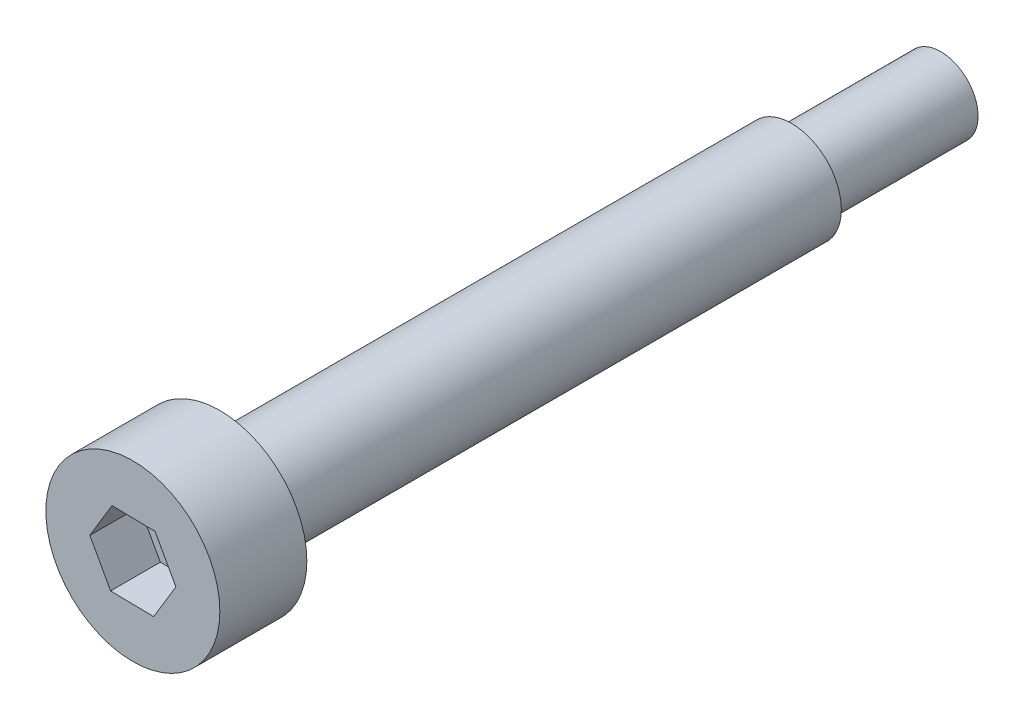
ISO-10303-21;
HEADER;
FILE_DESCRIPTION(('STEP AP214'),'2;1');
FILE_NAME('part.step','',(''),(''),'','','');
FILE_SCHEMA(('AUTOMOTIVE_DESIGN { 1 0 10303 214 1 1 1 1 }'));
ENDSEC;
DATA;
#1=APPLICATION_CONTEXT('core data for automotive mechanical design processes');
#2=APPLICATION_PROTOCOL_DEFINITION('international standard','automotive_design',2000,#1);
#3=PRODUCT_CONTEXT('',#1,'mechanical');
#4=PRODUCT('Part','Part','',(#3));
#5=PRODUCT_RELATED_PRODUCT_CATEGORY('part','',(#4));
#6=PRODUCT_DEFINITION_FORMATION('','',#4);
#7=PRODUCT_DEFINITION_CONTEXT('part definition',#1,'design');
#8=PRODUCT_DEFINITION('design','',#6,#7);
#9=PRODUCT_DEFINITION_SHAPE('','',#8);
#10=(LENGTH_UNIT() NAMED_UNIT(*) SI_UNIT(.MILLI.,.METRE.));
#11=(NAMED_UNIT(*) PLANE_ANGLE_UNIT() SI_UNIT($,.RADIAN.));
#12=(NAMED_UNIT(*) SI_UNIT($,.STERADIAN.) SOLID_ANGLE_UNIT());
#13=UNCERTAINTY_MEASURE_WITH_UNIT(LENGTH_MEASURE(1.E-05),#10,'distance_accuracy_value','');
#14=(GEOMETRIC_REPRESENTATION_CONTEXT(3) GLOBAL_UNCERTAINTY_ASSIGNED_CONTEXT((#13)) GLOBAL_UNIT_ASSIGNED_CONTEXT((#10,
#11,#12)) REPRESENTATION_CONTEXT('',''));
#15=CARTESIAN_POINT('',(0.,0.,0.));
#16=DIRECTION('',(0.,0.,1.));
#17=DIRECTION('',(1.,0.,0.));
#18=AXIS2_PLACEMENT_3D('',#15,#16,#17);
#19=CARTESIAN_POINT('',(0.,0.,3.5));
#20=DIRECTION('',(0.,0.,-1.));
#21=DIRECTION('',(-1.,0.,0.));
#22=AXIS2_PLACEMENT_3D('',#19,#20,#21);
#23=CYLINDRICAL_SURFACE('',#22,3.5);
#24=CARTESIAN_POINT('',(0.,0.,3.5));
#25=DIRECTION('',(0.,0.,1.));
#26=DIRECTION('',(1.,0.,0.));
#27=AXIS2_PLACEMENT_3D('',#24,#25,#26);
#28=CIRCLE('',#27,3.5);
#29=CARTESIAN_POINT('',(3.5,0.,3.5));
#30=VERTEX_POINT('',#29);
#31=EDGE_CURVE('E43',#30,#30,#28,.T.);
#32=ORIENTED_EDGE('',*,*,#31,.F.);
#33=EDGE_LOOP('',(#32));
#34=FACE_BOUND('',#33,.T.);
#35=CARTESIAN_POINT('',(0.,0.,0.));
#36=DIRECTION('',(0.,0.,1.));
#37=DIRECTION('',(1.,0.,0.));
#38=AXIS2_PLACEMENT_3D('',#35,#36,#37);
#39=CIRCLE('',#38,3.5);
#40=CARTESIAN_POINT('',(3.5,0.,0.));
#41=VERTEX_POINT('',#40);
#42=EDGE_CURVE('E138',#41,#41,#39,.T.);
#43=ORIENTED_EDGE('',*,*,#42,.T.);
#44=EDGE_LOOP('',(#43));
#45=FACE_BOUND('',#44,.T.);
#46=ADVANCED_FACE('F36',(#34,#45),#23,.T.);
#47=CARTESIAN_POINT('',(0.,0.,3.5));
#48=DIRECTION('',(0.,0.,1.));
#49=DIRECTION('',(1.,0.,0.));
#50=AXIS2_PLACEMENT_3D('',#47,#48,#49);
#51=PLANE('',#50);
#52=DIRECTION('',(-0.483885708586405,0.875131202178183,0.));
#53=VECTOR('',#52,1.);
#54=CARTESIAN_POINT('',(1.73175411943134,-0.0320572898511147,3.5));
#55=LINE('',#54,#53);
#56=CARTESIAN_POINT('',(1.73175411943134,-0.0320572898511147,3.5));
#57=VERTEX_POINT('',#56);
#58=CARTESIAN_POINT('',(0.893639487103215,1.48371441561033,3.5));
#59=VERTEX_POINT('',#58);
#60=EDGE_CURVE('E50',#57,#59,#55,.T.);
#61=ORIENTED_EDGE('',*,*,#60,.F.);
#62=DIRECTION('',(0.51594299843752,0.856622917253152,0.));
#63=VECTOR('',#62,1.);
#64=CARTESIAN_POINT('',(0.838114632328121,-1.51577170546145,3.5));
#65=LINE('',#64,#63);
#66=CARTESIAN_POINT('',(0.838114632328121,-1.51577170546145,3.5));
#67=VERTEX_POINT('',#66);
#68=EDGE_CURVE('E134',#67,#57,#65,.T.);
#69=ORIENTED_EDGE('',*,*,#68,.F.);
#70=DIRECTION('',(0.999828707023925,-0.0185082849250311,0.));
#71=VECTOR('',#70,1.);
#72=CARTESIAN_POINT('',(-0.893639487103214,-1.48371441561033,3.5));
#73=LINE('',#72,#71);
#74=CARTESIAN_POINT('',(-0.893639487103214,-1.48371441561033,3.5));
#75=VERTEX_POINT('',#74);
#76=EDGE_CURVE('E132',#75,#67,#73,.T.);
#77=ORIENTED_EDGE('',*,*,#76,.F.);
#78=DIRECTION('',(0.483885708586405,-0.875131202178183,0.));
#79=VECTOR('',#78,1.);
#80=CARTESIAN_POINT('',(-1.73175411943134,0.0320572898511147,3.5));
#81=LINE('',#80,#79);
#82=CARTESIAN_POINT('',(-1.73175411943134,0.0320572898511147,3.5));
#83=VERTEX_POINT('',#82);
#84=EDGE_CURVE('E98',#83,#75,#81,.T.);
#85=ORIENTED_EDGE('',*,*,#84,.F.);
#86=DIRECTION('',(-0.51594299843752,-0.856622917253152,0.));
#87=VECTOR('',#86,1.);
#88=CARTESIAN_POINT('',(-0.838114632328121,1.51577170546145,3.5));
#89=LINE('',#88,#87);
#90=CARTESIAN_POINT('',(-0.838114632328121,1.51577170546145,3.5));
#91=VERTEX_POINT('',#90);
#92=EDGE_CURVE('E128',#91,#83,#89,.T.);
#93=ORIENTED_EDGE('',*,*,#92,.F.);
#94=DIRECTION('',(-0.999828707023925,0.0185082849250311,0.));
#95=VECTOR('',#94,1.);
#96=CARTESIAN_POINT('',(0.893639487103215,1.48371441561033,3.5));
#97=LINE('',#96,#95);
#98=EDGE_CURVE('E124',#59,#91,#97,.T.);
#99=ORIENTED_EDGE('',*,*,#98,.F.);
#100=EDGE_LOOP('',(#61,#69,#77,#85,#93,#99));
#101=FACE_BOUND('',#100,.T.);
#102=ORIENTED_EDGE('',*,*,#31,.T.);
#103=EDGE_LOOP('',(#102));
#104=FACE_BOUND('',#103,.T.);
#105=ADVANCED_FACE('F152',(#101,#104),#51,.T.);
#106=CARTESIAN_POINT('',(0.,0.,0.));
#107=DIRECTION('',(0.,0.,1.));
#108=DIRECTION('',(1.,0.,0.));
#109=AXIS2_PLACEMENT_3D('',#106,#107,#108);
#110=PLANE('',#109);
#111=CARTESIAN_POINT('',(0.,0.,0.));
#112=DIRECTION('',(0.,0.,1.));
#113=DIRECTION('',(1.,0.,0.));
#114=AXIS2_PLACEMENT_3D('',#111,#112,#113);
#115=CIRCLE('',#114,2.);
#116=CARTESIAN_POINT('',(2.,0.,0.));
#117=VERTEX_POINT('',#116);
#118=EDGE_CURVE('E11',#117,#117,#115,.F.);
#119=ORIENTED_EDGE('',*,*,#118,.F.);
#120=EDGE_LOOP('',(#119));
#121=FACE_BOUND('',#120,.T.);
#122=ORIENTED_EDGE('',*,*,#42,.F.);
#123=EDGE_LOOP('',(#122));
#124=FACE_BOUND('',#123,.T.);
#125=ADVANCED_FACE('F149',(#121,#124),#110,.F.);
#126=CARTESIAN_POINT('',(1.73175411943134,-0.0320572898511147,1.5));
#127=DIRECTION('',(0.875131202178183,0.483885708586405,0.));
#128=DIRECTION('',(-0.483885708586405,0.875131202178183,0.));
#129=AXIS2_PLACEMENT_3D('',#126,#127,#128);
#130=PLANE('',#129);
#131=ORIENTED_EDGE('',*,*,#60,.T.);
#132=DIRECTION('',(0.,0.,1.));
#133=VECTOR('',#132,1.);
#134=CARTESIAN_POINT('',(0.893639487103215,1.48371441561033,1.5));
#135=LINE('',#134,#133);
#136=CARTESIAN_POINT('',(0.893639487103215,1.48371441561033,1.5));
#137=VERTEX_POINT('',#136);
#138=EDGE_CURVE('E80',#137,#59,#135,.T.);
#139=ORIENTED_EDGE('',*,*,#138,.F.);
#140=DIRECTION('',(-0.483885708586405,0.875131202178183,0.));
#141=VECTOR('',#140,1.);
#142=CARTESIAN_POINT('',(1.73175411943134,-0.0320572898511147,1.5));
#143=LINE('',#142,#141);
#144=CARTESIAN_POINT('',(1.73175411943134,-0.0320572898511147,1.5));
#145=VERTEX_POINT('',#144);
#146=EDGE_CURVE('E136',#145,#137,#143,.T.);
#147=ORIENTED_EDGE('',*,*,#146,.F.);
#148=DIRECTION('',(0.,0.,1.));
#149=VECTOR('',#148,1.);
#150=CARTESIAN_POINT('',(1.73175411943134,-0.0320572898511147,1.5));
#151=LINE('',#150,#149);
#152=EDGE_CURVE('E58',#145,#57,#151,.T.);
#153=ORIENTED_EDGE('',*,*,#152,.T.);
#154=EDGE_LOOP('',(#131,#139,#147,#153));
#155=FACE_BOUND('',#154,.T.);
#156=ADVANCED_FACE('F151',(#155),#130,.F.);
#157=CARTESIAN_POINT('',(0.838114632328121,-1.51577170546145,1.5));
#158=DIRECTION('',(0.856622917253152,-0.51594299843752,0.));
#159=DIRECTION('',(0.51594299843752,0.856622917253153,0.));
#160=AXIS2_PLACEMENT_3D('',#157,#158,#159);
#161=PLANE('',#160);
#162=ORIENTED_EDGE('',*,*,#68,.T.);
#163=ORIENTED_EDGE('',*,*,#152,.F.);
#164=DIRECTION('',(0.51594299843752,0.856622917253152,0.));
#165=VECTOR('',#164,1.);
#166=CARTESIAN_POINT('',(0.838114632328121,-1.51577170546145,1.5));
#167=LINE('',#166,#165);
#168=CARTESIAN_POINT('',(0.838114632328121,-1.51577170546145,1.5));
#169=VERTEX_POINT('',#168);
#170=EDGE_CURVE('E110',#169,#145,#167,.T.);
#171=ORIENTED_EDGE('',*,*,#170,.F.);
#172=DIRECTION('',(0.,0.,1.));
#173=VECTOR('',#172,1.);
#174=CARTESIAN_POINT('',(0.838114632328121,-1.51577170546145,1.5));
#175=LINE('',#174,#173);
#176=EDGE_CURVE('E102',#169,#67,#175,.T.);
#177=ORIENTED_EDGE('',*,*,#176,.T.);
#178=EDGE_LOOP('',(#162,#163,#171,#177));
#179=FACE_BOUND('',#178,.T.);
#180=ADVANCED_FACE('F158',(#179),#161,.F.);
#181=CARTESIAN_POINT('',(-0.893639487103214,-1.48371441561033,1.5));
#182=DIRECTION('',(-0.0185082849250311,-0.999828707023925,0.));
#183=DIRECTION('',(0.999828707023925,-0.0185082849250311,0.));
#184=AXIS2_PLACEMENT_3D('',#181,#182,#183);
#185=PLANE('',#184);
#186=ORIENTED_EDGE('',*,*,#76,.T.);
#187=ORIENTED_EDGE('',*,*,#176,.F.);
#188=DIRECTION('',(0.999828707023925,-0.0185082849250311,0.));
#189=VECTOR('',#188,1.);
#190=CARTESIAN_POINT('',(-0.893639487103214,-1.48371441561033,1.5));
#191=LINE('',#190,#189);
#192=CARTESIAN_POINT('',(-0.893639487103214,-1.48371441561033,1.5));
#193=VERTEX_POINT('',#192);
#194=EDGE_CURVE('E106',#193,#169,#191,.T.);
#195=ORIENTED_EDGE('',*,*,#194,.F.);
#196=DIRECTION('',(0.,0.,1.));
#197=VECTOR('',#196,1.);
#198=CARTESIAN_POINT('',(-0.893639487103214,-1.48371441561033,1.5));
#199=LINE('',#198,#197);
#200=EDGE_CURVE('E91',#193,#75,#199,.T.);
#201=ORIENTED_EDGE('',*,*,#200,.T.);
#202=EDGE_LOOP('',(#186,#187,#195,#201));
#203=FACE_BOUND('',#202,.T.);
#204=ADVANCED_FACE('F107',(#203),#185,.F.);
#205=CARTESIAN_POINT('',(-1.73175411943134,0.0320572898511147,1.5));
#206=DIRECTION('',(-0.875131202178183,-0.483885708586405,0.));
#207=DIRECTION('',(0.483885708586405,-0.875131202178183,0.));
#208=AXIS2_PLACEMENT_3D('',#205,#206,#207);
#209=PLANE('',#208);
#210=ORIENTED_EDGE('',*,*,#84,.T.);
#211=ORIENTED_EDGE('',*,*,#200,.F.);
#212=DIRECTION('',(0.483885708586405,-0.875131202178183,0.));
#213=VECTOR('',#212,1.);
#214=CARTESIAN_POINT('',(-1.73175411943134,0.0320572898511147,1.5));
#215=LINE('',#214,#213);
#216=CARTESIAN_POINT('',(-1.73175411943134,0.0320572898511147,1.5));
#217=VERTEX_POINT('',#216);
#218=EDGE_CURVE('E95',#217,#193,#215,.T.);
#219=ORIENTED_EDGE('',*,*,#218,.F.);
#220=DIRECTION('',(0.,0.,1.));
#221=VECTOR('',#220,1.);
#222=CARTESIAN_POINT('',(-1.73175411943134,0.0320572898511147,1.5));
#223=LINE('',#222,#221);
#224=EDGE_CURVE('E103',#217,#83,#223,.T.);
#225=ORIENTED_EDGE('',*,*,#224,.T.);
#226=EDGE_LOOP('',(#210,#211,#219,#225));
#227=FACE_BOUND('',#226,.T.);
#228=ADVANCED_FACE('F93',(#227),#209,.F.);
#229=CARTESIAN_POINT('',(-0.838114632328121,1.51577170546145,1.5));
#230=DIRECTION('',(-0.856622917253152,0.51594299843752,0.));
#231=DIRECTION('',(-0.51594299843752,-0.856622917253153,0.));
#232=AXIS2_PLACEMENT_3D('',#229,#230,#231);
#233=PLANE('',#232);
#234=ORIENTED_EDGE('',*,*,#92,.T.);
#235=ORIENTED_EDGE('',*,*,#224,.F.);
#236=DIRECTION('',(-0.51594299843752,-0.856622917253152,0.));
#237=VECTOR('',#236,1.);
#238=CARTESIAN_POINT('',(-0.838114632328121,1.51577170546145,1.5));
#239=LINE('',#238,#237);
#240=CARTESIAN_POINT('',(-0.838114632328121,1.51577170546145,1.5));
#241=VERTEX_POINT('',#240);
#242=EDGE_CURVE('E116',#241,#217,#239,.T.);
#243=ORIENTED_EDGE('',*,*,#242,.F.);
#244=DIRECTION('',(0.,0.,1.));
#245=VECTOR('',#244,1.);
#246=CARTESIAN_POINT('',(-0.838114632328121,1.51577170546145,1.5));
#247=LINE('',#246,#245);
#248=EDGE_CURVE('E141',#241,#91,#247,.T.);
#249=ORIENTED_EDGE('',*,*,#248,.T.);
#250=EDGE_LOOP('',(#234,#235,#243,#249));
#251=FACE_BOUND('',#250,.T.);
#252=ADVANCED_FACE('F205',(#251),#233,.F.);
#253=CARTESIAN_POINT('',(0.893639487103215,1.48371441561033,1.5));
#254=DIRECTION('',(0.0185082849250311,0.999828707023925,0.));
#255=DIRECTION('',(-0.999828707023925,0.0185082849250311,0.));
#256=AXIS2_PLACEMENT_3D('',#253,#254,#255);
#257=PLANE('',#256);
#258=ORIENTED_EDGE('',*,*,#98,.T.);
#259=ORIENTED_EDGE('',*,*,#248,.F.);
#260=DIRECTION('',(-0.999828707023925,0.0185082849250311,0.));
#261=VECTOR('',#260,1.);
#262=CARTESIAN_POINT('',(0.893639487103215,1.48371441561033,1.5));
#263=LINE('',#262,#261);
#264=EDGE_CURVE('E118',#137,#241,#263,.T.);
#265=ORIENTED_EDGE('',*,*,#264,.F.);
#266=ORIENTED_EDGE('',*,*,#138,.T.);
#267=EDGE_LOOP('',(#258,#259,#265,#266));
#268=FACE_BOUND('',#267,.T.);
#269=ADVANCED_FACE('F214',(#268),#257,.F.);
#270=CARTESIAN_POINT('',(0.,0.,1.5));
#271=DIRECTION('',(0.,0.,1.));
#272=DIRECTION('',(1.,0.,0.));
#273=AXIS2_PLACEMENT_3D('',#270,#271,#272);
#274=PLANE('',#273);
#275=ORIENTED_EDGE('',*,*,#146,.T.);
#276=ORIENTED_EDGE('',*,*,#264,.T.);
#277=ORIENTED_EDGE('',*,*,#242,.T.);
#278=ORIENTED_EDGE('',*,*,#218,.T.);
#279=ORIENTED_EDGE('',*,*,#194,.T.);
#280=ORIENTED_EDGE('',*,*,#170,.T.);
#281=EDGE_LOOP('',(#275,#276,#277,#278,#279,#280));
#282=FACE_BOUND('',#281,.T.);
#283=ADVANCED_FACE('F113',(#282),#274,.T.);
#284=CARTESIAN_POINT('',(0.,0.,-23.));
#285=DIRECTION('',(0.,0.,1.));
#286=DIRECTION('',(1.,0.,0.));
#287=AXIS2_PLACEMENT_3D('',#284,#285,#286);
#288=CYLINDRICAL_SURFACE('',#287,2.);
#289=CARTESIAN_POINT('',(0.,0.,-23.));
#290=DIRECTION('',(0.,0.,-1.));
#291=DIRECTION('',(-1.,0.,0.));
#292=AXIS2_PLACEMENT_3D('',#289,#290,#291);
#293=CIRCLE('',#292,2.);
#294=CARTESIAN_POINT('',(-2.,0.,-23.));
#295=VERTEX_POINT('',#294);
#296=EDGE_CURVE('E125',#295,#295,#293,.T.);
#297=ORIENTED_EDGE('',*,*,#296,.F.);
#298=EDGE_LOOP('',(#297));
#299=FACE_BOUND('',#298,.T.);
#300=ORIENTED_EDGE('',*,*,#118,.T.);
#301=EDGE_LOOP('',(#300));
#302=FACE_BOUND('',#301,.T.);
#303=ADVANCED_FACE('F232',(#299,#302),#288,.T.);
#304=CARTESIAN_POINT('',(0.,0.,-23.));
#305=DIRECTION('',(0.,0.,-1.));
#306=DIRECTION('',(-1.,0.,0.));
#307=AXIS2_PLACEMENT_3D('',#304,#305,#306);
#308=PLANE('',#307);
#309=CARTESIAN_POINT('',(0.,0.,-23.));
#310=DIRECTION('',(0.,0.,-1.));
#311=DIRECTION('',(-1.,0.,0.));
#312=AXIS2_PLACEMENT_3D('',#309,#310,#311);
#313=CIRCLE('',#312,1.5);
#314=CARTESIAN_POINT('',(-1.5,0.,-23.));
#315=VERTEX_POINT('',#314);
#316=EDGE_CURVE('E284',#315,#315,#313,.T.);
#317=ORIENTED_EDGE('',*,*,#316,.F.);
#318=EDGE_LOOP('',(#317));
#319=FACE_BOUND('',#318,.T.);
#320=ORIENTED_EDGE('',*,*,#296,.T.);
#321=EDGE_LOOP('',(#320));
#322=FACE_BOUND('',#321,.T.);
#323=ADVANCED_FACE('F245',(#319,#322),#308,.T.);
#324=CARTESIAN_POINT('',(0.,0.,-29.));
#325=DIRECTION('',(0.,0.,1.));
#326=DIRECTION('',(1.,0.,0.));
#327=AXIS2_PLACEMENT_3D('',#324,#325,#326);
#328=CYLINDRICAL_SURFACE('',#327,1.5);
#329=CARTESIAN_POINT('',(0.,0.,-29.));
#330=DIRECTION('',(0.,0.,-1.));
#331=DIRECTION('',(-1.,0.,0.));
#332=AXIS2_PLACEMENT_3D('',#329,#330,#331);
#333=CIRCLE('',#332,1.5);
#334=CARTESIAN_POINT('',(-1.5,0.,-29.));
#335=VERTEX_POINT('',#334);
#336=EDGE_CURVE('E283',#335,#335,#333,.T.);
#337=ORIENTED_EDGE('',*,*,#336,.F.);
#338=EDGE_LOOP('',(#337));
#339=FACE_BOUND('',#338,.T.);
#340=ORIENTED_EDGE('',*,*,#316,.T.);
#341=EDGE_LOOP('',(#340));
#342=FACE_BOUND('',#341,.T.);
#343=ADVANCED_FACE('F255',(#339,#342),#328,.T.);
#344=CARTESIAN_POINT('',(0.,0.,-29.));
#345=DIRECTION('',(0.,0.,-1.));
#346=DIRECTION('',(-1.,0.,0.));
#347=AXIS2_PLACEMENT_3D('',#344,#345,#346);
#348=PLANE('',#347);
#349=ORIENTED_EDGE('',*,*,#336,.T.);
#350=EDGE_LOOP('',(#349));
#351=FACE_BOUND('',#350,.T.);
#352=ADVANCED_FACE('F266',(#351),#348,.T.);
#353=CLOSED_SHELL('',(#46,#105,#125,#156,#180,#204,#228,#252,#269,#283,#303,#323,#343,#352));
#354=MANIFOLD_SOLID_BREP('B2',#353);
#355=ADVANCED_BREP_SHAPE_REPRESENTATION('',(#18,#354),#14);
#356=SHAPE_DEFINITION_REPRESENTATION(#9,#355);
ENDSEC;
END-ISO-10303-21;
